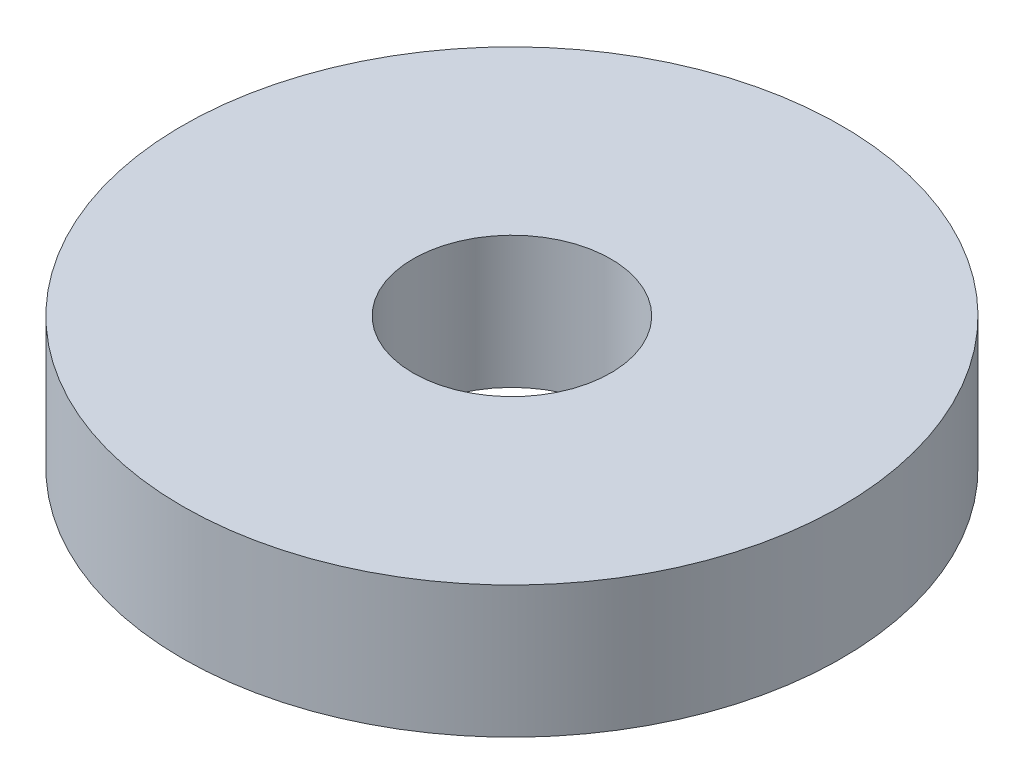
ISO-10303-21;
HEADER;
FILE_DESCRIPTION(('STEP AP214'),'2;1');
FILE_NAME('part.step','',(''),(''),'','','');
FILE_SCHEMA(('AUTOMOTIVE_DESIGN { 1 0 10303 214 1 1 1 1 }'));
ENDSEC;
DATA;
#1=APPLICATION_CONTEXT('core data for automotive mechanical design processes');
#2=APPLICATION_PROTOCOL_DEFINITION('international standard','automotive_design',2000,#1);
#3=PRODUCT_CONTEXT('',#1,'mechanical');
#4=PRODUCT('Part','Part','',(#3));
#5=PRODUCT_RELATED_PRODUCT_CATEGORY('part','',(#4));
#6=PRODUCT_DEFINITION_FORMATION('','',#4);
#7=PRODUCT_DEFINITION_CONTEXT('part definition',#1,'design');
#8=PRODUCT_DEFINITION('design','',#6,#7);
#9=PRODUCT_DEFINITION_SHAPE('','',#8);
#10=(LENGTH_UNIT() NAMED_UNIT(*) SI_UNIT(.MILLI.,.METRE.));
#11=(NAMED_UNIT(*) PLANE_ANGLE_UNIT() SI_UNIT($,.RADIAN.));
#12=(NAMED_UNIT(*) SI_UNIT($,.STERADIAN.) SOLID_ANGLE_UNIT());
#13=UNCERTAINTY_MEASURE_WITH_UNIT(LENGTH_MEASURE(1.E-05),#10,'distance_accuracy_value','');
#14=(GEOMETRIC_REPRESENTATION_CONTEXT(3) GLOBAL_UNCERTAINTY_ASSIGNED_CONTEXT((#13)) GLOBAL_UNIT_ASSIGNED_CONTEXT((#10,
#11,#12)) REPRESENTATION_CONTEXT('',''));
#15=CARTESIAN_POINT('',(0.,0.,0.));
#16=DIRECTION('',(0.,0.,1.));
#17=DIRECTION('',(1.,0.,0.));
#18=AXIS2_PLACEMENT_3D('',#15,#16,#17);
#19=CARTESIAN_POINT('',(0.,4.,0.));
#20=DIRECTION('',(0.,1.,0.));
#21=DIRECTION('',(0.,0.,1.));
#22=AXIS2_PLACEMENT_3D('',#19,#20,#21);
#23=PLANE('',#22);
#24=CARTESIAN_POINT('',(0.,4.,0.));
#25=DIRECTION('',(0.,1.,0.));
#26=DIRECTION('',(0.,0.,1.));
#27=AXIS2_PLACEMENT_3D('',#24,#25,#26);
#28=CIRCLE('',#27,10.);
#29=CARTESIAN_POINT('',(0.,4.,10.));
#30=VERTEX_POINT('',#29);
#31=EDGE_CURVE('E10',#30,#30,#28,.T.);
#32=ORIENTED_EDGE('',*,*,#31,.T.);
#33=EDGE_LOOP('',(#32));
#34=FACE_BOUND('',#33,.T.);
#35=CARTESIAN_POINT('',(0.,4.,0.));
#36=DIRECTION('',(0.,1.,0.));
#37=DIRECTION('',(0.,0.,1.));
#38=AXIS2_PLACEMENT_3D('',#35,#36,#37);
#39=CIRCLE('',#38,3.);
#40=CARTESIAN_POINT('',(0.,4.,3.));
#41=VERTEX_POINT('',#40);
#42=EDGE_CURVE('E62',#41,#41,#39,.T.);
#43=ORIENTED_EDGE('',*,*,#42,.F.);
#44=EDGE_LOOP('',(#43));
#45=FACE_BOUND('',#44,.T.);
#46=ADVANCED_FACE('F50',(#34,#45),#23,.T.);
#47=CARTESIAN_POINT('',(0.,0.,0.));
#48=DIRECTION('',(0.,1.,0.));
#49=DIRECTION('',(0.,0.,1.));
#50=AXIS2_PLACEMENT_3D('',#47,#48,#49);
#51=PLANE('',#50);
#52=CARTESIAN_POINT('',(0.,0.,0.));
#53=DIRECTION('',(0.,1.,0.));
#54=DIRECTION('',(0.,0.,1.));
#55=AXIS2_PLACEMENT_3D('',#52,#53,#54);
#56=CIRCLE('',#55,10.);
#57=CARTESIAN_POINT('',(0.,0.,10.));
#58=VERTEX_POINT('',#57);
#59=EDGE_CURVE('E51',#58,#58,#56,.T.);
#60=ORIENTED_EDGE('',*,*,#59,.F.);
#61=EDGE_LOOP('',(#60));
#62=FACE_BOUND('',#61,.T.);
#63=CARTESIAN_POINT('',(0.,0.,0.));
#64=DIRECTION('',(0.,1.,0.));
#65=DIRECTION('',(0.,0.,1.));
#66=AXIS2_PLACEMENT_3D('',#63,#64,#65);
#67=CIRCLE('',#66,3.);
#68=CARTESIAN_POINT('',(0.,0.,3.));
#69=VERTEX_POINT('',#68);
#70=EDGE_CURVE('E61',#69,#69,#67,.T.);
#71=ORIENTED_EDGE('',*,*,#70,.T.);
#72=EDGE_LOOP('',(#71));
#73=FACE_BOUND('',#72,.T.);
#74=ADVANCED_FACE('F78',(#62,#73),#51,.F.);
#75=CARTESIAN_POINT('',(0.,4.,0.));
#76=DIRECTION('',(0.,-1.,0.));
#77=DIRECTION('',(0.,0.,-1.));
#78=AXIS2_PLACEMENT_3D('',#75,#76,#77);
#79=CYLINDRICAL_SURFACE('',#78,10.);
#80=ORIENTED_EDGE('',*,*,#31,.F.);
#81=EDGE_LOOP('',(#80));
#82=FACE_BOUND('',#81,.T.);
#83=ORIENTED_EDGE('',*,*,#59,.T.);
#84=EDGE_LOOP('',(#83));
#85=FACE_BOUND('',#84,.T.);
#86=ADVANCED_FACE('F47',(#82,#85),#79,.T.);
#87=CARTESIAN_POINT('',(0.,4.,0.));
#88=DIRECTION('',(0.,-1.,0.));
#89=DIRECTION('',(0.,0.,-1.));
#90=AXIS2_PLACEMENT_3D('',#87,#88,#89);
#91=CYLINDRICAL_SURFACE('',#90,3.);
#92=ORIENTED_EDGE('',*,*,#42,.T.);
#93=EDGE_LOOP('',(#92));
#94=FACE_BOUND('',#93,.T.);
#95=ORIENTED_EDGE('',*,*,#70,.F.);
#96=EDGE_LOOP('',(#95));
#97=FACE_BOUND('',#96,.T.);
#98=ADVANCED_FACE('F75',(#94,#97),#91,.F.);
#99=CLOSED_SHELL('',(#46,#74,#86,#98));
#100=MANIFOLD_SOLID_BREP('B2',#99);
#101=ADVANCED_BREP_SHAPE_REPRESENTATION('',(#18,#100),#14);
#102=SHAPE_DEFINITION_REPRESENTATION(#9,#101);
ENDSEC;
END-ISO-10303-21;
